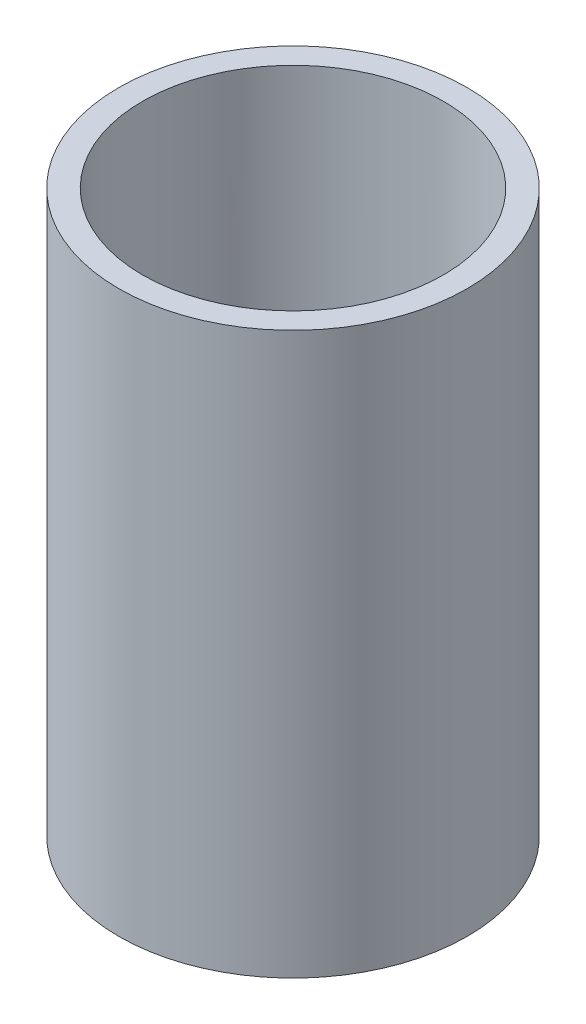
ISO-10303-21;
HEADER;
FILE_DESCRIPTION(('STEP AP214'),'2;1');
FILE_NAME('part.step','',(''),(''),'','','');
FILE_SCHEMA(('AUTOMOTIVE_DESIGN { 1 0 10303 214 1 1 1 1 }'));
ENDSEC;
DATA;
#1=APPLICATION_CONTEXT('core data for automotive mechanical design processes');
#2=APPLICATION_PROTOCOL_DEFINITION('international standard','automotive_design',2000,#1);
#3=PRODUCT_CONTEXT('',#1,'mechanical');
#4=PRODUCT('Part','Part','',(#3));
#5=PRODUCT_RELATED_PRODUCT_CATEGORY('part','',(#4));
#6=PRODUCT_DEFINITION_FORMATION('','',#4);
#7=PRODUCT_DEFINITION_CONTEXT('part definition',#1,'design');
#8=PRODUCT_DEFINITION('design','',#6,#7);
#9=PRODUCT_DEFINITION_SHAPE('','',#8);
#10=(LENGTH_UNIT() NAMED_UNIT(*) SI_UNIT(.MILLI.,.METRE.));
#11=(NAMED_UNIT(*) PLANE_ANGLE_UNIT() SI_UNIT($,.RADIAN.));
#12=(NAMED_UNIT(*) SI_UNIT($,.STERADIAN.) SOLID_ANGLE_UNIT());
#13=UNCERTAINTY_MEASURE_WITH_UNIT(LENGTH_MEASURE(1.E-05),#10,'distance_accuracy_value','');
#14=(GEOMETRIC_REPRESENTATION_CONTEXT(3) GLOBAL_UNCERTAINTY_ASSIGNED_CONTEXT((#13)) GLOBAL_UNIT_ASSIGNED_CONTEXT((#10,
#11,#12)) REPRESENTATION_CONTEXT('',''));
#15=CARTESIAN_POINT('',(0.,0.,0.));
#16=DIRECTION('',(0.,0.,1.));
#17=DIRECTION('',(1.,0.,0.));
#18=AXIS2_PLACEMENT_3D('',#15,#16,#17);
#19=CARTESIAN_POINT('',(0.,59.1,0.));
#20=DIRECTION('',(0.,-1.,0.));
#21=DIRECTION('',(0.,0.,-1.));
#22=AXIS2_PLACEMENT_3D('',#19,#20,#21);
#23=CYLINDRICAL_SURFACE('',#22,18.35);
#24=CARTESIAN_POINT('',(0.,59.1,0.));
#25=DIRECTION('',(0.,1.,0.));
#26=DIRECTION('',(0.,0.,1.));
#27=AXIS2_PLACEMENT_3D('',#24,#25,#26);
#28=CIRCLE('',#27,18.35);
#29=CARTESIAN_POINT('',(0.,59.1,18.35));
#30=VERTEX_POINT('',#29);
#31=EDGE_CURVE('E10',#30,#30,#28,.T.);
#32=ORIENTED_EDGE('',*,*,#31,.F.);
#33=EDGE_LOOP('',(#32));
#34=FACE_BOUND('',#33,.T.);
#35=CARTESIAN_POINT('',(0.,0.,0.));
#36=DIRECTION('',(0.,1.,0.));
#37=DIRECTION('',(0.,0.,1.));
#38=AXIS2_PLACEMENT_3D('',#35,#36,#37);
#39=CIRCLE('',#38,18.35);
#40=CARTESIAN_POINT('',(0.,0.,18.35));
#41=VERTEX_POINT('',#40);
#42=EDGE_CURVE('E40',#41,#41,#39,.T.);
#43=ORIENTED_EDGE('',*,*,#42,.T.);
#44=EDGE_LOOP('',(#43));
#45=FACE_BOUND('',#44,.T.);
#46=ADVANCED_FACE('F37',(#34,#45),#23,.T.);
#47=CARTESIAN_POINT('',(0.,59.1,0.));
#48=DIRECTION('',(0.,1.,0.));
#49=DIRECTION('',(0.,0.,1.));
#50=AXIS2_PLACEMENT_3D('',#47,#48,#49);
#51=PLANE('',#50);
#52=CARTESIAN_POINT('',(0.,59.1,0.));
#53=DIRECTION('',(0.,1.,0.));
#54=DIRECTION('',(0.,0.,1.));
#55=AXIS2_PLACEMENT_3D('',#52,#53,#54);
#56=CIRCLE('',#55,15.85);
#57=CARTESIAN_POINT('',(0.,59.1,15.85));
#58=VERTEX_POINT('',#57);
#59=EDGE_CURVE('E47',#58,#58,#56,.T.);
#60=ORIENTED_EDGE('',*,*,#59,.F.);
#61=EDGE_LOOP('',(#60));
#62=FACE_BOUND('',#61,.T.);
#63=ORIENTED_EDGE('',*,*,#31,.T.);
#64=EDGE_LOOP('',(#63));
#65=FACE_BOUND('',#64,.T.);
#66=ADVANCED_FACE('F64',(#62,#65),#51,.T.);
#67=CARTESIAN_POINT('',(0.,0.,0.));
#68=DIRECTION('',(0.,1.,0.));
#69=DIRECTION('',(0.,0.,1.));
#70=AXIS2_PLACEMENT_3D('',#67,#68,#69);
#71=PLANE('',#70);
#72=ORIENTED_EDGE('',*,*,#42,.F.);
#73=EDGE_LOOP('',(#72));
#74=FACE_BOUND('',#73,.T.);
#75=ADVANCED_FACE('F60',(#74),#71,.F.);
#76=CARTESIAN_POINT('',(0.,2.,0.));
#77=DIRECTION('',(0.,1.,0.));
#78=DIRECTION('',(0.,0.,1.));
#79=AXIS2_PLACEMENT_3D('',#76,#77,#78);
#80=CYLINDRICAL_SURFACE('',#79,15.85);
#81=CARTESIAN_POINT('',(0.,17.85,0.));
#82=DIRECTION('',(0.707106781186547,0.707106781186548,0.));
#83=DIRECTION('',(-0.707106781186548,0.707106781186547,0.));
#84=AXIS2_PLACEMENT_3D('',#81,#82,#83);
#85=ELLIPSE('',#84,22.4152849636136,15.85);
#86=CARTESIAN_POINT('',(-15.85,33.7,0.));
#87=VERTEX_POINT('',#86);
#88=EDGE_CURVE('E51',#87,#87,#85,.T.);
#89=ORIENTED_EDGE('',*,*,#88,.F.);
#90=EDGE_LOOP('',(#89));
#91=FACE_BOUND('',#90,.T.);
#92=ORIENTED_EDGE('',*,*,#59,.T.);
#93=EDGE_LOOP('',(#92));
#94=FACE_BOUND('',#93,.T.);
#95=ADVANCED_FACE('F57',(#91,#94),#80,.F.);
#96=CARTESIAN_POINT('',(-15.85,33.7,-18.352));
#97=DIRECTION('',(0.707106781186547,0.707106781186548,0.));
#98=DIRECTION('',(-0.707106781186548,0.707106781186547,0.));
#99=AXIS2_PLACEMENT_3D('',#96,#97,#98);
#100=PLANE('',#99);
#101=ORIENTED_EDGE('',*,*,#88,.T.);
#102=EDGE_LOOP('',(#101));
#103=FACE_BOUND('',#102,.T.);
#104=ADVANCED_FACE('F55',(#103),#100,.T.);
#105=CLOSED_SHELL('',(#46,#66,#75,#95,#104));
#106=MANIFOLD_SOLID_BREP('B2',#105);
#107=ADVANCED_BREP_SHAPE_REPRESENTATION('',(#18,#106),#14);
#108=SHAPE_DEFINITION_REPRESENTATION(#9,#107);
ENDSEC;
END-ISO-10303-21;
